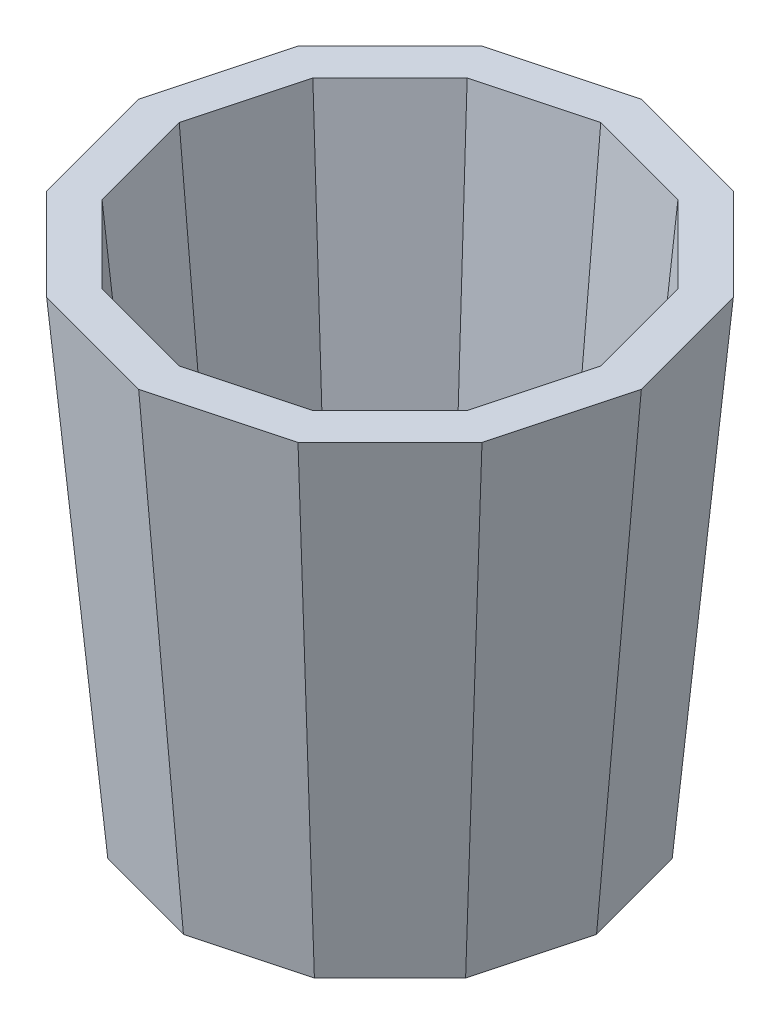
ISO-10303-21;
HEADER;
FILE_DESCRIPTION(('STEP AP214'),'2;1');
FILE_NAME('part.step','',(''),(''),'','','');
FILE_SCHEMA(('AUTOMOTIVE_DESIGN { 1 0 10303 214 1 1 1 1 }'));
ENDSEC;
DATA;
#1=APPLICATION_CONTEXT('core data for automotive mechanical design processes');
#2=APPLICATION_PROTOCOL_DEFINITION('international standard','automotive_design',2000,#1);
#3=PRODUCT_CONTEXT('',#1,'mechanical');
#4=PRODUCT('Part','Part','',(#3));
#5=PRODUCT_RELATED_PRODUCT_CATEGORY('part','',(#4));
#6=PRODUCT_DEFINITION_FORMATION('','',#4);
#7=PRODUCT_DEFINITION_CONTEXT('part definition',#1,'design');
#8=PRODUCT_DEFINITION('design','',#6,#7);
#9=PRODUCT_DEFINITION_SHAPE('','',#8);
#10=(LENGTH_UNIT() NAMED_UNIT(*) SI_UNIT(.MILLI.,.METRE.));
#11=(NAMED_UNIT(*) PLANE_ANGLE_UNIT() SI_UNIT($,.RADIAN.));
#12=(NAMED_UNIT(*) SI_UNIT($,.STERADIAN.) SOLID_ANGLE_UNIT());
#13=UNCERTAINTY_MEASURE_WITH_UNIT(LENGTH_MEASURE(1.E-05),#10,'distance_accuracy_value','');
#14=(GEOMETRIC_REPRESENTATION_CONTEXT(3) GLOBAL_UNCERTAINTY_ASSIGNED_CONTEXT((#13)) GLOBAL_UNIT_ASSIGNED_CONTEXT((#10,
#11,#12)) REPRESENTATION_CONTEXT('',''));
#15=CARTESIAN_POINT('',(0.,0.,0.));
#16=DIRECTION('',(0.,0.,1.));
#17=DIRECTION('',(1.,0.,0.));
#18=AXIS2_PLACEMENT_3D('',#15,#16,#17);
#19=CARTESIAN_POINT('',(106.237570574702,0.,61.3362899693558));
#20=DIRECTION('',(0.962250186899058,-0.0871557427476582,0.257834160496299));
#21=DIRECTION('',(0.258819045102521,0.,-0.965925826289068));
#22=AXIS2_PLACEMENT_3D('',#19,#20,#21);
#23=PLANE('',#22);
#24=DIRECTION('',(0.258819045102521,0.,-0.965925826289068));
#25=VECTOR('',#24,1.);
#26=CARTESIAN_POINT('',(106.237570574702,0.,61.3362899693558));
#27=LINE('',#26,#25);
#28=CARTESIAN_POINT('',(106.237570574702,0.,61.3362899693558));
#29=VERTEX_POINT('',#28);
#30=CARTESIAN_POINT('',(122.672579938712,0.,0.));
#31=VERTEX_POINT('',#30);
#32=EDGE_CURVE('E294',#29,#31,#27,.T.);
#33=ORIENTED_EDGE('',*,*,#32,.F.);
#34=DIRECTION('',(0.0781204015696534,0.995923158253083,0.045102834875441));
#35=VECTOR('',#34,1.);
#36=CARTESIAN_POINT('',(106.12175465553,-1.4764869826604,61.2694236172454));
#37=LINE('',#36,#35);
#38=CARTESIAN_POINT('',(87.3099527735227,-241.3,50.4084247367268));
#39=VERTEX_POINT('',#38);
#40=EDGE_CURVE('E11',#39,#29,#37,.T.);
#41=ORIENTED_EDGE('',*,*,#40,.F.);
#42=DIRECTION('',(0.258819045102521,0.,-0.965925826289068));
#43=VECTOR('',#42,1.);
#44=CARTESIAN_POINT('',(94.0634011234881,-241.3,25.2042123683634));
#45=LINE('',#44,#43);
#46=CARTESIAN_POINT('',(100.816849473454,-241.3,0.));
#47=VERTEX_POINT('',#46);
#48=EDGE_CURVE('E337',#39,#47,#45,.T.);
#49=ORIENTED_EDGE('',*,*,#48,.T.);
#50=DIRECTION('',(0.090205669750882,0.995923158253083,0.));
#51=VECTOR('',#50,1.);
#52=CARTESIAN_POINT('',(122.538847234491,-1.4764869826604,0.));
#53=LINE('',#52,#51);
#54=EDGE_CURVE('E339',#47,#31,#53,.T.);
#55=ORIENTED_EDGE('',*,*,#54,.T.);
#56=EDGE_LOOP('',(#33,#41,#49,#55));
#57=FACE_BOUND('',#56,.T.);
#58=ADVANCED_FACE('F35',(#57),#23,.T.);
#59=CARTESIAN_POINT('',(61.3362899693558,0.,106.237570574702));
#60=DIRECTION('',(0.704416026402759,-0.0871557427476582,0.704416026402758));
#61=DIRECTION('',(0.707106781186547,0.,-0.707106781186548));
#62=AXIS2_PLACEMENT_3D('',#59,#60,#61);
#63=PLANE('',#62);
#64=DIRECTION('',(0.707106781186547,0.,-0.707106781186548));
#65=VECTOR('',#64,1.);
#66=CARTESIAN_POINT('',(61.3362899693558,0.,106.237570574702));
#67=LINE('',#66,#65);
#68=CARTESIAN_POINT('',(61.3362899693558,0.,106.237570574702));
#69=VERTEX_POINT('',#68);
#70=EDGE_CURVE('E334',#69,#29,#67,.T.);
#71=ORIENTED_EDGE('',*,*,#70,.F.);
#72=DIRECTION('',(0.045102834875441,0.995923158253083,0.0781204015696533));
#73=VECTOR('',#72,1.);
#74=CARTESIAN_POINT('',(61.2694236172454,-1.4764869826604,106.12175465553));
#75=LINE('',#74,#73);
#76=CARTESIAN_POINT('',(50.4084247367268,-241.3,87.3099527735227));
#77=VERTEX_POINT('',#76);
#78=EDGE_CURVE('E45',#77,#69,#75,.T.);
#79=ORIENTED_EDGE('',*,*,#78,.F.);
#80=DIRECTION('',(0.707106781186547,0.,-0.707106781186548));
#81=VECTOR('',#80,1.);
#82=CARTESIAN_POINT('',(68.8591887551248,-241.3,68.8591887551247));
#83=LINE('',#82,#81);
#84=EDGE_CURVE('E342',#77,#39,#83,.T.);
#85=ORIENTED_EDGE('',*,*,#84,.T.);
#86=ORIENTED_EDGE('',*,*,#40,.T.);
#87=EDGE_LOOP('',(#71,#79,#85,#86));
#88=FACE_BOUND('',#87,.T.);
#89=ADVANCED_FACE('F37',(#88),#63,.T.);
#90=CARTESIAN_POINT('',(0.,0.,122.672579938712));
#91=DIRECTION('',(0.257834160496299,-0.0871557427476582,0.962250186899058));
#92=DIRECTION('',(0.965925826289068,0.,-0.258819045102521));
#93=AXIS2_PLACEMENT_3D('',#90,#91,#92);
#94=PLANE('',#93);
#95=DIRECTION('',(0.965925826289068,0.,-0.258819045102521));
#96=VECTOR('',#95,1.);
#97=CARTESIAN_POINT('',(0.,0.,122.672579938712));
#98=LINE('',#97,#96);
#99=CARTESIAN_POINT('',(0.,0.,122.672579938712));
#100=VERTEX_POINT('',#99);
#101=EDGE_CURVE('E330',#100,#69,#98,.T.);
#102=ORIENTED_EDGE('',*,*,#101,.F.);
#103=DIRECTION('',(0.,0.995923158253083,0.090205669750882));
#104=VECTOR('',#103,1.);
#105=CARTESIAN_POINT('',(0.,-1.4764869826604,122.538847234491));
#106=LINE('',#105,#104);
#107=CARTESIAN_POINT('',(0.,-241.3,100.816849473454));
#108=VERTEX_POINT('',#107);
#109=EDGE_CURVE('E359',#108,#100,#106,.T.);
#110=ORIENTED_EDGE('',*,*,#109,.F.);
#111=DIRECTION('',(0.965925826289068,0.,-0.258819045102521));
#112=VECTOR('',#111,1.);
#113=CARTESIAN_POINT('',(25.2042123683634,-241.3,94.0634011234881));
#114=LINE('',#113,#112);
#115=EDGE_CURVE('E369',#108,#77,#114,.T.);
#116=ORIENTED_EDGE('',*,*,#115,.T.);
#117=ORIENTED_EDGE('',*,*,#78,.T.);
#118=EDGE_LOOP('',(#102,#110,#116,#117));
#119=FACE_BOUND('',#118,.T.);
#120=ADVANCED_FACE('F449',(#119),#94,.T.);
#121=CARTESIAN_POINT('',(-61.3362899693558,0.,106.237570574702));
#122=DIRECTION('',(-0.2578341604963,-0.0871557427476582,0.962250186899058));
#123=DIRECTION('',(0.965925826289068,0.,0.258819045102521));
#124=AXIS2_PLACEMENT_3D('',#121,#122,#123);
#125=PLANE('',#124);
#126=DIRECTION('',(0.965925826289068,0.,0.258819045102521));
#127=VECTOR('',#126,1.);
#128=CARTESIAN_POINT('',(-61.3362899693558,0.,106.237570574702));
#129=LINE('',#128,#127);
#130=CARTESIAN_POINT('',(-61.3362899693558,0.,106.237570574702));
#131=VERTEX_POINT('',#130);
#132=EDGE_CURVE('E326',#131,#100,#129,.T.);
#133=ORIENTED_EDGE('',*,*,#132,.F.);
#134=DIRECTION('',(-0.045102834875441,0.995923158253083,0.0781204015696533));
#135=VECTOR('',#134,1.);
#136=CARTESIAN_POINT('',(-61.2694236172454,-1.4764869826604,106.12175465553));
#137=LINE('',#136,#135);
#138=CARTESIAN_POINT('',(-50.4084247367268,-241.3,87.3099527735227));
#139=VERTEX_POINT('',#138);
#140=EDGE_CURVE('E356',#139,#131,#137,.T.);
#141=ORIENTED_EDGE('',*,*,#140,.F.);
#142=DIRECTION('',(0.965925826289068,0.,0.258819045102521));
#143=VECTOR('',#142,1.);
#144=CARTESIAN_POINT('',(-25.2042123683634,-241.3,94.0634011234881));
#145=LINE('',#144,#143);
#146=EDGE_CURVE('E373',#139,#108,#145,.T.);
#147=ORIENTED_EDGE('',*,*,#146,.T.);
#148=ORIENTED_EDGE('',*,*,#109,.T.);
#149=EDGE_LOOP('',(#133,#141,#147,#148));
#150=FACE_BOUND('',#149,.T.);
#151=ADVANCED_FACE('F424',(#150),#125,.T.);
#152=CARTESIAN_POINT('',(-106.237570574702,0.,61.3362899693558));
#153=DIRECTION('',(-0.704416026402758,-0.0871557427476582,0.704416026402759));
#154=DIRECTION('',(0.707106781186548,0.,0.707106781186547));
#155=AXIS2_PLACEMENT_3D('',#152,#153,#154);
#156=PLANE('',#155);
#157=DIRECTION('',(0.707106781186548,0.,0.707106781186547));
#158=VECTOR('',#157,1.);
#159=CARTESIAN_POINT('',(-106.237570574702,0.,61.3362899693558));
#160=LINE('',#159,#158);
#161=CARTESIAN_POINT('',(-106.237570574702,0.,61.3362899693558));
#162=VERTEX_POINT('',#161);
#163=EDGE_CURVE('E323',#162,#131,#160,.T.);
#164=ORIENTED_EDGE('',*,*,#163,.F.);
#165=DIRECTION('',(-0.0781204015696533,0.995923158253083,0.0451028348754411));
#166=VECTOR('',#165,1.);
#167=CARTESIAN_POINT('',(-106.12175465553,-1.4764869826604,61.2694236172454));
#168=LINE('',#167,#166);
#169=CARTESIAN_POINT('',(-87.3099527735227,-241.3,50.4084247367268));
#170=VERTEX_POINT('',#169);
#171=EDGE_CURVE('E354',#170,#162,#168,.T.);
#172=ORIENTED_EDGE('',*,*,#171,.F.);
#173=DIRECTION('',(0.707106781186548,0.,0.707106781186547));
#174=VECTOR('',#173,1.);
#175=CARTESIAN_POINT('',(-68.8591887551247,-241.3,68.8591887551248));
#176=LINE('',#175,#174);
#177=EDGE_CURVE('E377',#170,#139,#176,.T.);
#178=ORIENTED_EDGE('',*,*,#177,.T.);
#179=ORIENTED_EDGE('',*,*,#140,.T.);
#180=EDGE_LOOP('',(#164,#172,#178,#179));
#181=FACE_BOUND('',#180,.T.);
#182=ADVANCED_FACE('F428',(#181),#156,.T.);
#183=CARTESIAN_POINT('',(-122.672579938712,0.,0.));
#184=DIRECTION('',(-0.962250186899058,-0.0871557427476582,0.257834160496299));
#185=DIRECTION('',(0.258819045102521,0.,0.965925826289068));
#186=AXIS2_PLACEMENT_3D('',#183,#184,#185);
#187=PLANE('',#186);
#188=DIRECTION('',(0.258819045102521,0.,0.965925826289068));
#189=VECTOR('',#188,1.);
#190=CARTESIAN_POINT('',(-122.672579938712,0.,0.));
#191=LINE('',#190,#189);
#192=CARTESIAN_POINT('',(-122.672579938712,0.,0.));
#193=VERTEX_POINT('',#192);
#194=EDGE_CURVE('E319',#193,#162,#191,.T.);
#195=ORIENTED_EDGE('',*,*,#194,.F.);
#196=DIRECTION('',(-0.090205669750882,0.995923158253083,0.));
#197=VECTOR('',#196,1.);
#198=CARTESIAN_POINT('',(-122.538847234491,-1.4764869826604,0.));
#199=LINE('',#198,#197);
#200=CARTESIAN_POINT('',(-100.816849473454,-241.3,0.));
#201=VERTEX_POINT('',#200);
#202=EDGE_CURVE('E352',#201,#193,#199,.T.);
#203=ORIENTED_EDGE('',*,*,#202,.F.);
#204=DIRECTION('',(0.258819045102521,0.,0.965925826289068));
#205=VECTOR('',#204,1.);
#206=CARTESIAN_POINT('',(-94.0634011234882,-241.3,25.2042123683634));
#207=LINE('',#206,#205);
#208=EDGE_CURVE('E380',#201,#170,#207,.T.);
#209=ORIENTED_EDGE('',*,*,#208,.T.);
#210=ORIENTED_EDGE('',*,*,#171,.T.);
#211=EDGE_LOOP('',(#195,#203,#209,#210));
#212=FACE_BOUND('',#211,.T.);
#213=ADVANCED_FACE('F433',(#212),#187,.T.);
#214=CARTESIAN_POINT('',(-106.237570574702,0.,-61.3362899693558));
#215=DIRECTION('',(-0.962250186899058,-0.0871557427476582,-0.257834160496299));
#216=DIRECTION('',(-0.25881904510252,0.,0.965925826289068));
#217=AXIS2_PLACEMENT_3D('',#214,#215,#216);
#218=PLANE('',#217);
#219=DIRECTION('',(-0.25881904510252,0.,0.965925826289068));
#220=VECTOR('',#219,1.);
#221=CARTESIAN_POINT('',(-106.237570574702,0.,-61.3362899693558));
#222=LINE('',#221,#220);
#223=CARTESIAN_POINT('',(-106.237570574702,0.,-61.3362899693558));
#224=VERTEX_POINT('',#223);
#225=EDGE_CURVE('E315',#224,#193,#222,.T.);
#226=ORIENTED_EDGE('',*,*,#225,.F.);
#227=DIRECTION('',(-0.0781204015696533,0.995923158253083,-0.045102834875441));
#228=VECTOR('',#227,1.);
#229=CARTESIAN_POINT('',(-106.12175465553,-1.4764869826604,-61.2694236172454));
#230=LINE('',#229,#228);
#231=CARTESIAN_POINT('',(-87.3099527735227,-241.3,-50.4084247367268));
#232=VERTEX_POINT('',#231);
#233=EDGE_CURVE('E350',#232,#224,#230,.T.);
#234=ORIENTED_EDGE('',*,*,#233,.F.);
#235=DIRECTION('',(-0.25881904510252,0.,0.965925826289068));
#236=VECTOR('',#235,1.);
#237=CARTESIAN_POINT('',(-94.0634011234882,-241.3,-25.2042123683634));
#238=LINE('',#237,#236);
#239=EDGE_CURVE('E384',#232,#201,#238,.T.);
#240=ORIENTED_EDGE('',*,*,#239,.T.);
#241=ORIENTED_EDGE('',*,*,#202,.T.);
#242=EDGE_LOOP('',(#226,#234,#240,#241));
#243=FACE_BOUND('',#242,.T.);
#244=ADVANCED_FACE('F436',(#243),#218,.T.);
#245=CARTESIAN_POINT('',(-61.3362899693558,0.,-106.237570574702));
#246=DIRECTION('',(-0.704416026402759,-0.0871557427476582,-0.704416026402758));
#247=DIRECTION('',(-0.707106781186547,0.,0.707106781186548));
#248=AXIS2_PLACEMENT_3D('',#245,#246,#247);
#249=PLANE('',#248);
#250=DIRECTION('',(-0.707106781186547,0.,0.707106781186548));
#251=VECTOR('',#250,1.);
#252=CARTESIAN_POINT('',(-61.3362899693558,0.,-106.237570574702));
#253=LINE('',#252,#251);
#254=CARTESIAN_POINT('',(-61.3362899693558,0.,-106.237570574702));
#255=VERTEX_POINT('',#254);
#256=EDGE_CURVE('E311',#255,#224,#253,.T.);
#257=ORIENTED_EDGE('',*,*,#256,.F.);
#258=DIRECTION('',(-0.0451028348754411,0.995923158253083,-0.0781204015696533));
#259=VECTOR('',#258,1.);
#260=CARTESIAN_POINT('',(-61.2694236172454,-1.4764869826604,-106.12175465553));
#261=LINE('',#260,#259);
#262=CARTESIAN_POINT('',(-50.4084247367268,-241.3,-87.3099527735227));
#263=VERTEX_POINT('',#262);
#264=EDGE_CURVE('E348',#263,#255,#261,.T.);
#265=ORIENTED_EDGE('',*,*,#264,.F.);
#266=DIRECTION('',(-0.707106781186547,0.,0.707106781186548));
#267=VECTOR('',#266,1.);
#268=CARTESIAN_POINT('',(-68.8591887551248,-241.3,-68.8591887551247));
#269=LINE('',#268,#267);
#270=EDGE_CURVE('E388',#263,#232,#269,.T.);
#271=ORIENTED_EDGE('',*,*,#270,.T.);
#272=ORIENTED_EDGE('',*,*,#233,.T.);
#273=EDGE_LOOP('',(#257,#265,#271,#272));
#274=FACE_BOUND('',#273,.T.);
#275=ADVANCED_FACE('F441',(#274),#249,.T.);
#276=CARTESIAN_POINT('',(0.,0.,-122.672579938712));
#277=DIRECTION('',(-0.2578341604963,-0.0871557427476582,-0.962250186899058));
#278=DIRECTION('',(-0.965925826289068,0.,0.258819045102521));
#279=AXIS2_PLACEMENT_3D('',#276,#277,#278);
#280=PLANE('',#279);
#281=DIRECTION('',(-0.965925826289068,0.,0.258819045102521));
#282=VECTOR('',#281,1.);
#283=CARTESIAN_POINT('',(0.,0.,-122.672579938712));
#284=LINE('',#283,#282);
#285=CARTESIAN_POINT('',(0.,0.,-122.672579938712));
#286=VERTEX_POINT('',#285);
#287=EDGE_CURVE('E308',#286,#255,#284,.T.);
#288=ORIENTED_EDGE('',*,*,#287,.F.);
#289=DIRECTION('',(0.,0.995923158253083,-0.090205669750882));
#290=VECTOR('',#289,1.);
#291=CARTESIAN_POINT('',(0.,-1.4764869826604,-122.538847234491));
#292=LINE('',#291,#290);
#293=CARTESIAN_POINT('',(0.,-241.3,-100.816849473454));
#294=VERTEX_POINT('',#293);
#295=EDGE_CURVE('E346',#294,#286,#292,.T.);
#296=ORIENTED_EDGE('',*,*,#295,.F.);
#297=DIRECTION('',(-0.965925826289068,0.,0.258819045102521));
#298=VECTOR('',#297,1.);
#299=CARTESIAN_POINT('',(-25.2042123683634,-241.3,-94.0634011234882));
#300=LINE('',#299,#298);
#301=EDGE_CURVE('E392',#294,#263,#300,.T.);
#302=ORIENTED_EDGE('',*,*,#301,.T.);
#303=ORIENTED_EDGE('',*,*,#264,.T.);
#304=EDGE_LOOP('',(#288,#296,#302,#303));
#305=FACE_BOUND('',#304,.T.);
#306=ADVANCED_FACE('F444',(#305),#280,.T.);
#307=CARTESIAN_POINT('',(61.3362899693557,0.,-106.237570574702));
#308=DIRECTION('',(0.257834160496299,-0.0871557427476582,-0.962250186899058));
#309=DIRECTION('',(-0.965925826289069,0.,-0.25881904510252));
#310=AXIS2_PLACEMENT_3D('',#307,#308,#309);
#311=PLANE('',#310);
#312=DIRECTION('',(-0.965925826289068,0.,-0.25881904510252));
#313=VECTOR('',#312,1.);
#314=CARTESIAN_POINT('',(61.3362899693557,0.,-106.237570574702));
#315=LINE('',#314,#313);
#316=CARTESIAN_POINT('',(61.3362899693557,0.,-106.237570574702));
#317=VERTEX_POINT('',#316);
#318=EDGE_CURVE('E305',#317,#286,#315,.T.);
#319=ORIENTED_EDGE('',*,*,#318,.F.);
#320=DIRECTION('',(0.045102834875441,0.995923158253083,-0.0781204015696534));
#321=VECTOR('',#320,1.);
#322=CARTESIAN_POINT('',(61.2694236172453,-1.4764869826604,-106.12175465553));
#323=LINE('',#322,#321);
#324=CARTESIAN_POINT('',(50.4084247367267,-241.3,-87.3099527735227));
#325=VERTEX_POINT('',#324);
#326=EDGE_CURVE('E344',#325,#317,#323,.T.);
#327=ORIENTED_EDGE('',*,*,#326,.F.);
#328=DIRECTION('',(-0.965925826289069,0.,-0.25881904510252));
#329=VECTOR('',#328,1.);
#330=CARTESIAN_POINT('',(25.2042123683634,-241.3,-94.0634011234882));
#331=LINE('',#330,#329);
#332=EDGE_CURVE('E395',#325,#294,#331,.T.);
#333=ORIENTED_EDGE('',*,*,#332,.T.);
#334=ORIENTED_EDGE('',*,*,#295,.T.);
#335=EDGE_LOOP('',(#319,#327,#333,#334));
#336=FACE_BOUND('',#335,.T.);
#337=ADVANCED_FACE('F447',(#336),#311,.T.);
#338=CARTESIAN_POINT('',(106.237570574702,0.,-61.3362899693558));
#339=DIRECTION('',(0.704416026402758,-0.0871557427476582,-0.704416026402759));
#340=DIRECTION('',(-0.707106781186548,0.,-0.707106781186547));
#341=AXIS2_PLACEMENT_3D('',#338,#339,#340);
#342=PLANE('',#341);
#343=DIRECTION('',(-0.707106781186548,0.,-0.707106781186547));
#344=VECTOR('',#343,1.);
#345=CARTESIAN_POINT('',(106.237570574702,0.,-61.3362899693558));
#346=LINE('',#345,#344);
#347=CARTESIAN_POINT('',(106.237570574702,0.,-61.3362899693558));
#348=VERTEX_POINT('',#347);
#349=EDGE_CURVE('E302',#348,#317,#346,.T.);
#350=ORIENTED_EDGE('',*,*,#349,.F.);
#351=DIRECTION('',(0.0781204015696533,0.995923158253083,-0.0451028348754411));
#352=VECTOR('',#351,1.);
#353=CARTESIAN_POINT('',(106.12175465553,-1.4764869826604,-61.2694236172454));
#354=LINE('',#353,#352);
#355=CARTESIAN_POINT('',(87.3099527735226,-241.3,-50.4084247367268));
#356=VERTEX_POINT('',#355);
#357=EDGE_CURVE('E341',#356,#348,#354,.T.);
#358=ORIENTED_EDGE('',*,*,#357,.F.);
#359=DIRECTION('',(-0.707106781186548,0.,-0.707106781186547));
#360=VECTOR('',#359,1.);
#361=CARTESIAN_POINT('',(68.8591887551247,-241.3,-68.8591887551248));
#362=LINE('',#361,#360);
#363=EDGE_CURVE('E397',#356,#325,#362,.T.);
#364=ORIENTED_EDGE('',*,*,#363,.T.);
#365=ORIENTED_EDGE('',*,*,#326,.T.);
#366=EDGE_LOOP('',(#350,#358,#364,#365));
#367=FACE_BOUND('',#366,.T.);
#368=ADVANCED_FACE('F448',(#367),#342,.T.);
#369=CARTESIAN_POINT('',(122.672579938712,0.,0.));
#370=DIRECTION('',(0.962250186899058,-0.0871557427476582,-0.2578341604963));
#371=DIRECTION('',(-0.258819045102521,0.,-0.965925826289068));
#372=AXIS2_PLACEMENT_3D('',#369,#370,#371);
#373=PLANE('',#372);
#374=DIRECTION('',(-0.258819045102521,0.,-0.965925826289068));
#375=VECTOR('',#374,1.);
#376=CARTESIAN_POINT('',(122.672579938712,0.,0.));
#377=LINE('',#376,#375);
#378=EDGE_CURVE('E298',#31,#348,#377,.T.);
#379=ORIENTED_EDGE('',*,*,#378,.F.);
#380=ORIENTED_EDGE('',*,*,#54,.F.);
#381=DIRECTION('',(-0.258819045102521,0.,-0.965925826289068));
#382=VECTOR('',#381,1.);
#383=CARTESIAN_POINT('',(94.0634011234881,-241.3,-25.2042123683634));
#384=LINE('',#383,#382);
#385=EDGE_CURVE('E39',#47,#356,#384,.T.);
#386=ORIENTED_EDGE('',*,*,#385,.T.);
#387=ORIENTED_EDGE('',*,*,#357,.T.);
#388=EDGE_LOOP('',(#379,#380,#386,#387));
#389=FACE_BOUND('',#388,.T.);
#390=ADVANCED_FACE('F407',(#389),#373,.T.);
#391=CARTESIAN_POINT('',(0.,-241.3,0.));
#392=DIRECTION('',(0.,1.,0.));
#393=DIRECTION('',(0.,0.,1.));
#394=AXIS2_PLACEMENT_3D('',#391,#392,#393);
#395=PLANE('',#394);
#396=DIRECTION('',(0.707106781186547,0.,-0.707106781186548));
#397=VECTOR('',#396,1.);
#398=CARTESIAN_POINT('',(55.3373498943008,-241.3,55.3373498943008));
#399=LINE('',#398,#397);
#400=CARTESIAN_POINT('',(40.5097516788444,-241.3,70.1649481097572));
#401=VERTEX_POINT('',#400);
#402=CARTESIAN_POINT('',(70.1649481097572,-241.3,40.5097516788444));
#403=VERTEX_POINT('',#402);
#404=EDGE_CURVE('E210',#401,#403,#399,.T.);
#405=ORIENTED_EDGE('',*,*,#404,.T.);
#406=DIRECTION('',(0.258819045102521,0.,-0.965925826289068));
#407=VECTOR('',#406,1.);
#408=CARTESIAN_POINT('',(75.592225733723,-241.3,20.2548758394222));
#409=LINE('',#408,#407);
#410=CARTESIAN_POINT('',(81.0195033576888,-241.3,0.));
#411=VERTEX_POINT('',#410);
#412=EDGE_CURVE('E259',#403,#411,#409,.T.);
#413=ORIENTED_EDGE('',*,*,#412,.T.);
#414=DIRECTION('',(-0.258819045102521,0.,-0.965925826289068));
#415=VECTOR('',#414,1.);
#416=CARTESIAN_POINT('',(75.592225733723,-241.3,-20.2548758394222));
#417=LINE('',#416,#415);
#418=CARTESIAN_POINT('',(70.1649481097571,-241.3,-40.5097516788445));
#419=VERTEX_POINT('',#418);
#420=EDGE_CURVE('E205',#411,#419,#417,.T.);
#421=ORIENTED_EDGE('',*,*,#420,.T.);
#422=DIRECTION('',(-0.707106781186548,0.,-0.707106781186547));
#423=VECTOR('',#422,1.);
#424=CARTESIAN_POINT('',(55.3373498943008,-241.3,-55.3373498943008));
#425=LINE('',#424,#423);
#426=CARTESIAN_POINT('',(40.5097516788443,-241.3,-70.1649481097572));
#427=VERTEX_POINT('',#426);
#428=EDGE_CURVE('E53',#419,#427,#425,.T.);
#429=ORIENTED_EDGE('',*,*,#428,.T.);
#430=DIRECTION('',(-0.965925826289069,0.,-0.25881904510252));
#431=VECTOR('',#430,1.);
#432=CARTESIAN_POINT('',(20.2548758394222,-241.3,-75.5922257337231));
#433=LINE('',#432,#431);
#434=CARTESIAN_POINT('',(0.,-241.3,-81.0195033576889));
#435=VERTEX_POINT('',#434);
#436=EDGE_CURVE('E287',#427,#435,#433,.T.);
#437=ORIENTED_EDGE('',*,*,#436,.T.);
#438=DIRECTION('',(-0.965925826289068,0.,0.258819045102521));
#439=VECTOR('',#438,1.);
#440=CARTESIAN_POINT('',(-20.2548758394222,-241.3,-75.5922257337231));
#441=LINE('',#440,#439);
#442=CARTESIAN_POINT('',(-40.5097516788444,-241.3,-70.1649481097572));
#443=VERTEX_POINT('',#442);
#444=EDGE_CURVE('E284',#435,#443,#441,.T.);
#445=ORIENTED_EDGE('',*,*,#444,.T.);
#446=DIRECTION('',(-0.707106781186547,0.,0.707106781186548));
#447=VECTOR('',#446,1.);
#448=CARTESIAN_POINT('',(-55.3373498943008,-241.3,-55.3373498943008));
#449=LINE('',#448,#447);
#450=CARTESIAN_POINT('',(-70.1649481097572,-241.3,-40.5097516788444));
#451=VERTEX_POINT('',#450);
#452=EDGE_CURVE('E281',#443,#451,#449,.T.);
#453=ORIENTED_EDGE('',*,*,#452,.T.);
#454=DIRECTION('',(-0.25881904510252,0.,0.965925826289068));
#455=VECTOR('',#454,1.);
#456=CARTESIAN_POINT('',(-75.592225733723,-241.3,-20.2548758394222));
#457=LINE('',#456,#455);
#458=CARTESIAN_POINT('',(-81.0195033576889,-241.3,0.));
#459=VERTEX_POINT('',#458);
#460=EDGE_CURVE('E277',#451,#459,#457,.T.);
#461=ORIENTED_EDGE('',*,*,#460,.T.);
#462=DIRECTION('',(0.258819045102521,0.,0.965925826289068));
#463=VECTOR('',#462,1.);
#464=CARTESIAN_POINT('',(-75.592225733723,-241.3,20.2548758394222));
#465=LINE('',#464,#463);
#466=CARTESIAN_POINT('',(-70.1649481097572,-241.3,40.5097516788444));
#467=VERTEX_POINT('',#466);
#468=EDGE_CURVE('E274',#459,#467,#465,.T.);
#469=ORIENTED_EDGE('',*,*,#468,.T.);
#470=DIRECTION('',(0.707106781186548,0.,0.707106781186547));
#471=VECTOR('',#470,1.);
#472=CARTESIAN_POINT('',(-55.3373498943008,-241.3,55.3373498943008));
#473=LINE('',#472,#471);
#474=CARTESIAN_POINT('',(-40.5097516788444,-241.3,70.1649481097572));
#475=VERTEX_POINT('',#474);
#476=EDGE_CURVE('E270',#467,#475,#473,.T.);
#477=ORIENTED_EDGE('',*,*,#476,.T.);
#478=DIRECTION('',(0.965925826289068,0.,0.258819045102521));
#479=VECTOR('',#478,1.);
#480=CARTESIAN_POINT('',(-20.2548758394222,-241.3,75.592225733723));
#481=LINE('',#480,#479);
#482=CARTESIAN_POINT('',(0.,-241.3,81.0195033576889));
#483=VERTEX_POINT('',#482);
#484=EDGE_CURVE('E267',#475,#483,#481,.T.);
#485=ORIENTED_EDGE('',*,*,#484,.T.);
#486=DIRECTION('',(0.965925826289068,0.,-0.258819045102521));
#487=VECTOR('',#486,1.);
#488=CARTESIAN_POINT('',(20.2548758394222,-241.3,75.5922257337231));
#489=LINE('',#488,#487);
#490=EDGE_CURVE('E264',#483,#401,#489,.T.);
#491=ORIENTED_EDGE('',*,*,#490,.T.);
#492=EDGE_LOOP('',(#405,#413,#421,#429,#437,#445,#453,#461,#469,#477,#485,#491));
#493=FACE_BOUND('',#492,.T.);
#494=ORIENTED_EDGE('',*,*,#48,.F.);
#495=ORIENTED_EDGE('',*,*,#84,.F.);
#496=ORIENTED_EDGE('',*,*,#115,.F.);
#497=ORIENTED_EDGE('',*,*,#146,.F.);
#498=ORIENTED_EDGE('',*,*,#177,.F.);
#499=ORIENTED_EDGE('',*,*,#208,.F.);
#500=ORIENTED_EDGE('',*,*,#239,.F.);
#501=ORIENTED_EDGE('',*,*,#270,.F.);
#502=ORIENTED_EDGE('',*,*,#301,.F.);
#503=ORIENTED_EDGE('',*,*,#332,.F.);
#504=ORIENTED_EDGE('',*,*,#363,.F.);
#505=ORIENTED_EDGE('',*,*,#385,.F.);
#506=EDGE_LOOP('',(#494,#495,#496,#497,#498,#499,#500,#501,#502,#503,#504,#505));
#507=FACE_BOUND('',#506,.T.);
#508=ADVANCED_FACE('F411',(#493,#507),#395,.F.);
#509=CARTESIAN_POINT('',(0.,0.,0.));
#510=DIRECTION('',(0.,1.,0.));
#511=DIRECTION('',(0.,0.,1.));
#512=AXIS2_PLACEMENT_3D('',#509,#510,#511);
#513=PLANE('',#512);
#514=DIRECTION('',(0.258819045102521,0.,-0.965925826289068));
#515=VECTOR('',#514,1.);
#516=CARTESIAN_POINT('',(95.9838998669414,0.,25.7188084557367));
#517=LINE('',#516,#515);
#518=CARTESIAN_POINT('',(89.0925659109361,0.,51.4376169114734));
#519=VERTEX_POINT('',#518);
#520=CARTESIAN_POINT('',(102.875233822947,0.,0.));
#521=VERTEX_POINT('',#520);
#522=EDGE_CURVE('E213',#519,#521,#517,.T.);
#523=ORIENTED_EDGE('',*,*,#522,.F.);
#524=DIRECTION('',(0.707106781186547,0.,-0.707106781186548));
#525=VECTOR('',#524,1.);
#526=CARTESIAN_POINT('',(70.2650914112048,0.,70.2650914112047));
#527=LINE('',#526,#525);
#528=CARTESIAN_POINT('',(51.4376169114734,0.,89.0925659109361));
#529=VERTEX_POINT('',#528);
#530=EDGE_CURVE('E257',#529,#519,#527,.T.);
#531=ORIENTED_EDGE('',*,*,#530,.F.);
#532=DIRECTION('',(0.965925826289068,0.,-0.258819045102521));
#533=VECTOR('',#532,1.);
#534=CARTESIAN_POINT('',(25.7188084557367,0.,95.9838998669415));
#535=LINE('',#534,#533);
#536=CARTESIAN_POINT('',(0.,0.,102.875233822947));
#537=VERTEX_POINT('',#536);
#538=EDGE_CURVE('E61',#537,#529,#535,.T.);
#539=ORIENTED_EDGE('',*,*,#538,.F.);
#540=DIRECTION('',(0.965925826289068,0.,0.258819045102521));
#541=VECTOR('',#540,1.);
#542=CARTESIAN_POINT('',(-25.7188084557367,0.,95.9838998669414));
#543=LINE('',#542,#541);
#544=CARTESIAN_POINT('',(-51.4376169114734,0.,89.0925659109361));
#545=VERTEX_POINT('',#544);
#546=EDGE_CURVE('E253',#545,#537,#543,.T.);
#547=ORIENTED_EDGE('',*,*,#546,.F.);
#548=DIRECTION('',(0.707106781186548,0.,0.707106781186547));
#549=VECTOR('',#548,1.);
#550=CARTESIAN_POINT('',(-70.2650914112047,0.,70.2650914112048));
#551=LINE('',#550,#549);
#552=CARTESIAN_POINT('',(-89.0925659109361,0.,51.4376169114734));
#553=VERTEX_POINT('',#552);
#554=EDGE_CURVE('E250',#553,#545,#551,.T.);
#555=ORIENTED_EDGE('',*,*,#554,.F.);
#556=DIRECTION('',(0.258819045102521,0.,0.965925826289068));
#557=VECTOR('',#556,1.);
#558=CARTESIAN_POINT('',(-95.9838998669415,0.,25.7188084557367));
#559=LINE('',#558,#557);
#560=CARTESIAN_POINT('',(-102.875233822947,0.,0.));
#561=VERTEX_POINT('',#560);
#562=EDGE_CURVE('E246',#561,#553,#559,.T.);
#563=ORIENTED_EDGE('',*,*,#562,.F.);
#564=DIRECTION('',(-0.25881904510252,0.,0.965925826289068));
#565=VECTOR('',#564,1.);
#566=CARTESIAN_POINT('',(-95.9838998669415,0.,-25.7188084557367));
#567=LINE('',#566,#565);
#568=CARTESIAN_POINT('',(-89.0925659109361,0.,-51.4376169114734));
#569=VERTEX_POINT('',#568);
#570=EDGE_CURVE('E243',#569,#561,#567,.T.);
#571=ORIENTED_EDGE('',*,*,#570,.F.);
#572=DIRECTION('',(-0.707106781186547,0.,0.707106781186548));
#573=VECTOR('',#572,1.);
#574=CARTESIAN_POINT('',(-70.2650914112048,0.,-70.2650914112047));
#575=LINE('',#574,#573);
#576=CARTESIAN_POINT('',(-51.4376169114734,0.,-89.0925659109361));
#577=VERTEX_POINT('',#576);
#578=EDGE_CURVE('E240',#577,#569,#575,.T.);
#579=ORIENTED_EDGE('',*,*,#578,.F.);
#580=DIRECTION('',(-0.965925826289068,0.,0.258819045102521));
#581=VECTOR('',#580,1.);
#582=CARTESIAN_POINT('',(-25.7188084557367,0.,-95.9838998669415));
#583=LINE('',#582,#581);
#584=CARTESIAN_POINT('',(0.,0.,-102.875233822947));
#585=VERTEX_POINT('',#584);
#586=EDGE_CURVE('E237',#585,#577,#583,.T.);
#587=ORIENTED_EDGE('',*,*,#586,.F.);
#588=DIRECTION('',(-0.965925826289069,0.,-0.25881904510252));
#589=VECTOR('',#588,1.);
#590=CARTESIAN_POINT('',(25.7188084557367,0.,-95.9838998669415));
#591=LINE('',#590,#589);
#592=CARTESIAN_POINT('',(51.4376169114733,0.,-89.0925659109361));
#593=VERTEX_POINT('',#592);
#594=EDGE_CURVE('E231',#593,#585,#591,.T.);
#595=ORIENTED_EDGE('',*,*,#594,.F.);
#596=DIRECTION('',(-0.707106781186548,0.,-0.707106781186547));
#597=VECTOR('',#596,1.);
#598=CARTESIAN_POINT('',(70.2650914112047,0.,-70.2650914112048));
#599=LINE('',#598,#597);
#600=CARTESIAN_POINT('',(89.092565910936,0.,-51.4376169114735));
#601=VERTEX_POINT('',#600);
#602=EDGE_CURVE('E225',#601,#593,#599,.T.);
#603=ORIENTED_EDGE('',*,*,#602,.F.);
#604=DIRECTION('',(-0.258819045102521,0.,-0.965925826289068));
#605=VECTOR('',#604,1.);
#606=CARTESIAN_POINT('',(95.9838998669414,0.,-25.7188084557367));
#607=LINE('',#606,#605);
#608=EDGE_CURVE('E202',#521,#601,#607,.T.);
#609=ORIENTED_EDGE('',*,*,#608,.F.);
#610=EDGE_LOOP('',(#523,#531,#539,#547,#555,#563,#571,#579,#587,#595,#603,#609));
#611=FACE_BOUND('',#610,.T.);
#612=ORIENTED_EDGE('',*,*,#32,.T.);
#613=ORIENTED_EDGE('',*,*,#378,.T.);
#614=ORIENTED_EDGE('',*,*,#349,.T.);
#615=ORIENTED_EDGE('',*,*,#318,.T.);
#616=ORIENTED_EDGE('',*,*,#287,.T.);
#617=ORIENTED_EDGE('',*,*,#256,.T.);
#618=ORIENTED_EDGE('',*,*,#225,.T.);
#619=ORIENTED_EDGE('',*,*,#194,.T.);
#620=ORIENTED_EDGE('',*,*,#163,.T.);
#621=ORIENTED_EDGE('',*,*,#132,.T.);
#622=ORIENTED_EDGE('',*,*,#101,.T.);
#623=ORIENTED_EDGE('',*,*,#70,.T.);
#624=EDGE_LOOP('',(#612,#613,#614,#615,#616,#617,#618,#619,#620,#621,#622,#623));
#625=FACE_BOUND('',#624,.T.);
#626=ADVANCED_FACE('F221',(#611,#625),#513,.T.);
#627=CARTESIAN_POINT('',(87.9067045142745,1.66031689934289,56.4245492119013));
#628=DIRECTION('',(0.962250186899058,-0.0871557427476582,0.257834160496299));
#629=DIRECTION('',(0.258819045102521,0.,-0.965925826289068));
#630=AXIS2_PLACEMENT_3D('',#627,#628,#629);
#631=PLANE('',#630);
#632=ORIENTED_EDGE('',*,*,#522,.T.);
#633=DIRECTION('',(0.090205669750882,0.995923158253083,0.));
#634=VECTOR('',#633,1.);
#635=CARTESIAN_POINT('',(102.902593368436,0.302065325022438,0.));
#636=LINE('',#635,#634);
#637=EDGE_CURVE('E198',#411,#521,#636,.T.);
#638=ORIENTED_EDGE('',*,*,#637,.F.);
#639=ORIENTED_EDGE('',*,*,#412,.F.);
#640=DIRECTION('',(0.0781204015696534,0.995923158253083,0.045102834875441));
#641=VECTOR('',#640,1.);
#642=CARTESIAN_POINT('',(89.1162599723659,0.302065325022437,51.4512966842181));
#643=LINE('',#642,#641);
#644=EDGE_CURVE('E215',#403,#519,#643,.T.);
#645=ORIENTED_EDGE('',*,*,#644,.T.);
#646=EDGE_LOOP('',(#632,#638,#639,#645));
#647=FACE_BOUND('',#646,.T.);
#648=ADVANCED_FACE('F214',(#647),#631,.F.);
#649=CARTESIAN_POINT('',(47.9171646663832,1.66031689934289,92.818445271729));
#650=DIRECTION('',(0.704416026402759,-0.0871557427476582,0.704416026402758));
#651=DIRECTION('',(0.707106781186547,0.,-0.707106781186548));
#652=AXIS2_PLACEMENT_3D('',#649,#650,#651);
#653=PLANE('',#652);
#654=ORIENTED_EDGE('',*,*,#530,.T.);
#655=ORIENTED_EDGE('',*,*,#644,.F.);
#656=ORIENTED_EDGE('',*,*,#404,.F.);
#657=DIRECTION('',(0.045102834875441,0.995923158253083,0.0781204015696533));
#658=VECTOR('',#657,1.);
#659=CARTESIAN_POINT('',(51.4512966842181,0.302065325022435,89.1162599723659));
#660=LINE('',#659,#658);
#661=EDGE_CURVE('E710',#401,#529,#660,.T.);
#662=ORIENTED_EDGE('',*,*,#661,.T.);
#663=EDGE_LOOP('',(#654,#655,#656,#662));
#664=FACE_BOUND('',#663,.T.);
#665=ADVANCED_FACE('F528',(#664),#653,.F.);
#666=CARTESIAN_POINT('',(-4.9117407574545,1.66031689934289,104.341713878285));
#667=DIRECTION('',(0.257834160496299,-0.0871557427476582,0.962250186899058));
#668=DIRECTION('',(0.965925826289068,0.,-0.258819045102521));
#669=AXIS2_PLACEMENT_3D('',#666,#667,#668);
#670=PLANE('',#669);
#671=ORIENTED_EDGE('',*,*,#538,.T.);
#672=ORIENTED_EDGE('',*,*,#661,.F.);
#673=ORIENTED_EDGE('',*,*,#490,.F.);
#674=DIRECTION('',(0.,0.995923158253083,0.090205669750882));
#675=VECTOR('',#674,1.);
#676=CARTESIAN_POINT('',(0.,0.302065325022437,102.902593368436));
#677=LINE('',#676,#675);
#678=EDGE_CURVE('E708',#483,#537,#677,.T.);
#679=ORIENTED_EDGE('',*,*,#678,.T.);
#680=EDGE_LOOP('',(#671,#672,#673,#679));
#681=FACE_BOUND('',#680,.T.);
#682=ADVANCED_FACE('F535',(#681),#670,.F.);
#683=CARTESIAN_POINT('',(-56.4245492119013,1.66031689934289,87.9067045142745));
#684=DIRECTION('',(-0.2578341604963,-0.0871557427476582,0.962250186899058));
#685=DIRECTION('',(0.965925826289068,0.,0.258819045102521));
#686=AXIS2_PLACEMENT_3D('',#683,#684,#685);
#687=PLANE('',#686);
#688=ORIENTED_EDGE('',*,*,#546,.T.);
#689=ORIENTED_EDGE('',*,*,#678,.F.);
#690=ORIENTED_EDGE('',*,*,#484,.F.);
#691=DIRECTION('',(-0.045102834875441,0.995923158253083,0.0781204015696533));
#692=VECTOR('',#691,1.);
#693=CARTESIAN_POINT('',(-51.4512966842181,0.30206532502244,89.1162599723659));
#694=LINE('',#693,#692);
#695=EDGE_CURVE('E706',#475,#545,#694,.T.);
#696=ORIENTED_EDGE('',*,*,#695,.T.);
#697=EDGE_LOOP('',(#688,#689,#690,#696));
#698=FACE_BOUND('',#697,.T.);
#699=ADVANCED_FACE('F543',(#698),#687,.F.);
#700=CARTESIAN_POINT('',(-92.818445271729,1.66031689934289,47.9171646663833));
#701=DIRECTION('',(-0.704416026402758,-0.0871557427476582,0.704416026402759));
#702=DIRECTION('',(0.707106781186548,0.,0.707106781186547));
#703=AXIS2_PLACEMENT_3D('',#700,#701,#702);
#704=PLANE('',#703);
#705=ORIENTED_EDGE('',*,*,#554,.T.);
#706=ORIENTED_EDGE('',*,*,#695,.F.);
#707=ORIENTED_EDGE('',*,*,#476,.F.);
#708=DIRECTION('',(-0.0781204015696533,0.995923158253083,0.0451028348754411));
#709=VECTOR('',#708,1.);
#710=CARTESIAN_POINT('',(-89.1162599723659,0.302065325022435,51.4512966842181));
#711=LINE('',#710,#709);
#712=EDGE_CURVE('E703',#467,#553,#711,.T.);
#713=ORIENTED_EDGE('',*,*,#712,.T.);
#714=EDGE_LOOP('',(#705,#706,#707,#713));
#715=FACE_BOUND('',#714,.T.);
#716=ADVANCED_FACE('F550',(#715),#704,.F.);
#717=CARTESIAN_POINT('',(-104.341713878285,1.66031689934289,-4.91174075745446));
#718=DIRECTION('',(-0.962250186899058,-0.0871557427476582,0.257834160496299));
#719=DIRECTION('',(0.258819045102521,0.,0.965925826289068));
#720=AXIS2_PLACEMENT_3D('',#717,#718,#719);
#721=PLANE('',#720);
#722=ORIENTED_EDGE('',*,*,#562,.T.);
#723=ORIENTED_EDGE('',*,*,#712,.F.);
#724=ORIENTED_EDGE('',*,*,#468,.F.);
#725=DIRECTION('',(-0.090205669750882,0.995923158253083,0.));
#726=VECTOR('',#725,1.);
#727=CARTESIAN_POINT('',(-102.902593368436,0.302065325022436,0.));
#728=LINE('',#727,#726);
#729=EDGE_CURVE('E701',#459,#561,#728,.T.);
#730=ORIENTED_EDGE('',*,*,#729,.T.);
#731=EDGE_LOOP('',(#722,#723,#724,#730));
#732=FACE_BOUND('',#731,.T.);
#733=ADVANCED_FACE('F558',(#732),#721,.F.);
#734=CARTESIAN_POINT('',(-87.9067045142745,1.66031689934289,-56.4245492119013));
#735=DIRECTION('',(-0.962250186899058,-0.0871557427476582,-0.257834160496299));
#736=DIRECTION('',(-0.25881904510252,0.,0.965925826289068));
#737=AXIS2_PLACEMENT_3D('',#734,#735,#736);
#738=PLANE('',#737);
#739=ORIENTED_EDGE('',*,*,#570,.T.);
#740=ORIENTED_EDGE('',*,*,#729,.F.);
#741=ORIENTED_EDGE('',*,*,#460,.F.);
#742=DIRECTION('',(-0.0781204015696533,0.995923158253083,-0.045102834875441));
#743=VECTOR('',#742,1.);
#744=CARTESIAN_POINT('',(-89.1162599723659,0.302065325022438,-51.4512966842181));
#745=LINE('',#744,#743);
#746=EDGE_CURVE('E699',#451,#569,#745,.T.);
#747=ORIENTED_EDGE('',*,*,#746,.T.);
#748=EDGE_LOOP('',(#739,#740,#741,#747));
#749=FACE_BOUND('',#748,.T.);
#750=ADVANCED_FACE('F566',(#749),#738,.F.);
#751=CARTESIAN_POINT('',(-47.9171646663832,1.66031689934289,-92.8184452717291));
#752=DIRECTION('',(-0.704416026402759,-0.0871557427476582,-0.704416026402758));
#753=DIRECTION('',(-0.707106781186547,0.,0.707106781186548));
#754=AXIS2_PLACEMENT_3D('',#751,#752,#753);
#755=PLANE('',#754);
#756=ORIENTED_EDGE('',*,*,#578,.T.);
#757=ORIENTED_EDGE('',*,*,#746,.F.);
#758=ORIENTED_EDGE('',*,*,#452,.F.);
#759=DIRECTION('',(-0.0451028348754411,0.995923158253083,-0.0781204015696533));
#760=VECTOR('',#759,1.);
#761=CARTESIAN_POINT('',(-51.4512966842181,0.302065325022436,-89.1162599723659));
#762=LINE('',#761,#760);
#763=EDGE_CURVE('E695',#443,#577,#762,.T.);
#764=ORIENTED_EDGE('',*,*,#763,.T.);
#765=EDGE_LOOP('',(#756,#757,#758,#764));
#766=FACE_BOUND('',#765,.T.);
#767=ADVANCED_FACE('F574',(#766),#755,.F.);
#768=CARTESIAN_POINT('',(4.91174075745444,1.66031689934289,-104.341713878285));
#769=DIRECTION('',(-0.2578341604963,-0.0871557427476582,-0.962250186899058));
#770=DIRECTION('',(-0.965925826289068,0.,0.258819045102521));
#771=AXIS2_PLACEMENT_3D('',#768,#769,#770);
#772=PLANE('',#771);
#773=ORIENTED_EDGE('',*,*,#586,.T.);
#774=ORIENTED_EDGE('',*,*,#763,.F.);
#775=ORIENTED_EDGE('',*,*,#444,.F.);
#776=DIRECTION('',(0.,0.995923158253083,-0.090205669750882));
#777=VECTOR('',#776,1.);
#778=CARTESIAN_POINT('',(0.,0.302065325022439,-102.902593368436));
#779=LINE('',#778,#777);
#780=EDGE_CURVE('E690',#435,#585,#779,.T.);
#781=ORIENTED_EDGE('',*,*,#780,.T.);
#782=EDGE_LOOP('',(#773,#774,#775,#781));
#783=FACE_BOUND('',#782,.T.);
#784=ADVANCED_FACE('F582',(#783),#772,.F.);
#785=CARTESIAN_POINT('',(56.4245492119012,1.66031689934289,-87.9067045142746));
#786=DIRECTION('',(0.257834160496299,-0.0871557427476582,-0.962250186899058));
#787=DIRECTION('',(-0.965925826289069,0.,-0.25881904510252));
#788=AXIS2_PLACEMENT_3D('',#785,#786,#787);
#789=PLANE('',#788);
#790=ORIENTED_EDGE('',*,*,#594,.T.);
#791=ORIENTED_EDGE('',*,*,#780,.F.);
#792=ORIENTED_EDGE('',*,*,#436,.F.);
#793=DIRECTION('',(0.045102834875441,0.995923158253083,-0.0781204015696534));
#794=VECTOR('',#793,1.);
#795=CARTESIAN_POINT('',(51.451296684218,0.302065325022436,-89.116259972366));
#796=LINE('',#795,#794);
#797=EDGE_CURVE('E686',#427,#593,#796,.T.);
#798=ORIENTED_EDGE('',*,*,#797,.T.);
#799=EDGE_LOOP('',(#790,#791,#792,#798));
#800=FACE_BOUND('',#799,.T.);
#801=ADVANCED_FACE('F590',(#800),#789,.F.);
#802=CARTESIAN_POINT('',(92.818445271729,1.66031689934289,-47.9171646663833));
#803=DIRECTION('',(0.704416026402758,-0.0871557427476582,-0.704416026402759));
#804=DIRECTION('',(-0.707106781186548,0.,-0.707106781186547));
#805=AXIS2_PLACEMENT_3D('',#802,#803,#804);
#806=PLANE('',#805);
#807=ORIENTED_EDGE('',*,*,#602,.T.);
#808=ORIENTED_EDGE('',*,*,#797,.F.);
#809=ORIENTED_EDGE('',*,*,#428,.F.);
#810=DIRECTION('',(0.0781204015696533,0.995923158253083,-0.0451028348754411));
#811=VECTOR('',#810,1.);
#812=CARTESIAN_POINT('',(89.1162599723659,0.302065325022433,-51.4512966842181));
#813=LINE('',#812,#811);
#814=EDGE_CURVE('E209',#419,#601,#813,.T.);
#815=ORIENTED_EDGE('',*,*,#814,.T.);
#816=EDGE_LOOP('',(#807,#808,#809,#815));
#817=FACE_BOUND('',#816,.T.);
#818=ADVANCED_FACE('F598',(#817),#806,.F.);
#819=CARTESIAN_POINT('',(104.341713878285,1.66031689934289,4.91174075745451));
#820=DIRECTION('',(0.962250186899058,-0.0871557427476582,-0.2578341604963));
#821=DIRECTION('',(-0.258819045102521,0.,-0.965925826289068));
#822=AXIS2_PLACEMENT_3D('',#819,#820,#821);
#823=PLANE('',#822);
#824=ORIENTED_EDGE('',*,*,#608,.T.);
#825=ORIENTED_EDGE('',*,*,#814,.F.);
#826=ORIENTED_EDGE('',*,*,#420,.F.);
#827=ORIENTED_EDGE('',*,*,#637,.T.);
#828=EDGE_LOOP('',(#824,#825,#826,#827));
#829=FACE_BOUND('',#828,.T.);
#830=ADVANCED_FACE('F200',(#829),#823,.F.);
#831=CLOSED_SHELL('',(#58,#89,#120,#151,#182,#213,#244,#275,#306,#337,#368,#390,#508,#626,#648,
#665,#682,#699,#716,#733,#750,#767,#784,#801,#818,#830));
#832=MANIFOLD_SOLID_BREP('B2',#831);
#833=ADVANCED_BREP_SHAPE_REPRESENTATION('',(#18,#832),#14);
#834=SHAPE_DEFINITION_REPRESENTATION(#9,#833);
ENDSEC;
END-ISO-10303-21;
